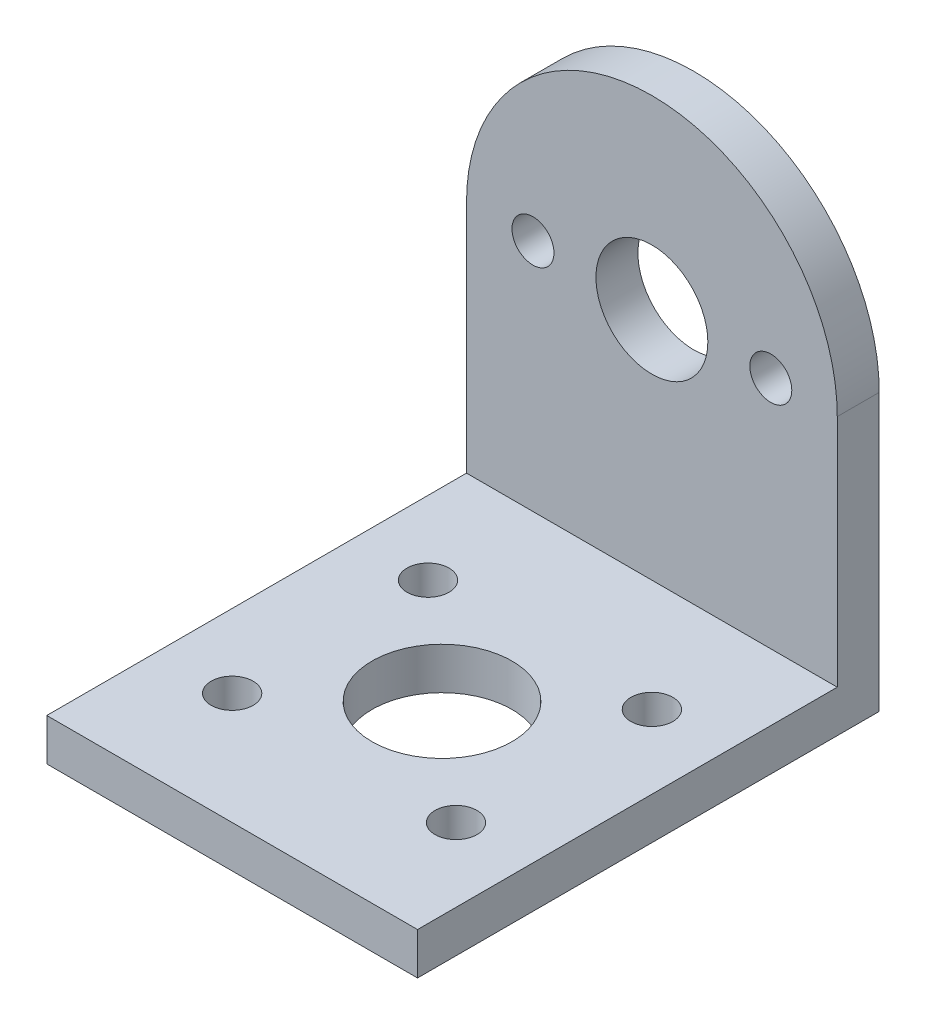
ISO-10303-21;
HEADER;
FILE_DESCRIPTION(('STEP AP214'),'2;1');
FILE_NAME('part.step','',(''),(''),'','','');
FILE_SCHEMA(('AUTOMOTIVE_DESIGN { 1 0 10303 214 1 1 1 1 }'));
ENDSEC;
DATA;
#1=APPLICATION_CONTEXT('core data for automotive mechanical design processes');
#2=APPLICATION_PROTOCOL_DEFINITION('international standard','automotive_design',2000,#1);
#3=PRODUCT_CONTEXT('',#1,'mechanical');
#4=PRODUCT('Part','Part','',(#3));
#5=PRODUCT_RELATED_PRODUCT_CATEGORY('part','',(#4));
#6=PRODUCT_DEFINITION_FORMATION('','',#4);
#7=PRODUCT_DEFINITION_CONTEXT('part definition',#1,'design');
#8=PRODUCT_DEFINITION('design','',#6,#7);
#9=PRODUCT_DEFINITION_SHAPE('','',#8);
#10=(LENGTH_UNIT() NAMED_UNIT(*) SI_UNIT(.MILLI.,.METRE.));
#11=(NAMED_UNIT(*) PLANE_ANGLE_UNIT() SI_UNIT($,.RADIAN.));
#12=(NAMED_UNIT(*) SI_UNIT($,.STERADIAN.) SOLID_ANGLE_UNIT());
#13=UNCERTAINTY_MEASURE_WITH_UNIT(LENGTH_MEASURE(1.E-05),#10,'distance_accuracy_value','');
#14=(GEOMETRIC_REPRESENTATION_CONTEXT(3) GLOBAL_UNCERTAINTY_ASSIGNED_CONTEXT((#13)) GLOBAL_UNIT_ASSIGNED_CONTEXT((#10,
#11,#12)) REPRESENTATION_CONTEXT('',''));
#15=CARTESIAN_POINT('',(0.,0.,0.));
#16=DIRECTION('',(0.,0.,1.));
#17=DIRECTION('',(1.,0.,0.));
#18=AXIS2_PLACEMENT_3D('',#15,#16,#17);
#19=CARTESIAN_POINT('',(0.,3.,0.));
#20=DIRECTION('',(0.,1.,0.));
#21=DIRECTION('',(0.,0.,1.));
#22=AXIS2_PLACEMENT_3D('',#19,#20,#21);
#23=PLANE('',#22);
#24=DIRECTION('',(1.,0.,0.));
#25=VECTOR('',#24,1.);
#26=CARTESIAN_POINT('',(-13.25,3.,3.));
#27=LINE('',#26,#25);
#28=CARTESIAN_POINT('',(-13.25,3.,3.));
#29=VERTEX_POINT('',#28);
#30=CARTESIAN_POINT('',(13.25,3.,3.));
#31=VERTEX_POINT('',#30);
#32=EDGE_CURVE('E49',#29,#31,#27,.T.);
#33=ORIENTED_EDGE('',*,*,#32,.F.);
#34=DIRECTION('',(0.,0.,1.));
#35=VECTOR('',#34,1.);
#36=CARTESIAN_POINT('',(-13.25,3.,0.));
#37=LINE('',#36,#35);
#38=CARTESIAN_POINT('',(-13.25,3.,33.));
#39=VERTEX_POINT('',#38);
#40=EDGE_CURVE('E88',#29,#39,#37,.T.);
#41=ORIENTED_EDGE('',*,*,#40,.T.);
#42=DIRECTION('',(1.,0.,0.));
#43=VECTOR('',#42,1.);
#44=CARTESIAN_POINT('',(-13.25,3.,33.));
#45=LINE('',#44,#43);
#46=CARTESIAN_POINT('',(13.25,3.,33.));
#47=VERTEX_POINT('',#46);
#48=EDGE_CURVE('E55',#39,#47,#45,.T.);
#49=ORIENTED_EDGE('',*,*,#48,.T.);
#50=DIRECTION('',(0.,0.,-1.));
#51=VECTOR('',#50,1.);
#52=CARTESIAN_POINT('',(13.25,3.,0.));
#53=LINE('',#52,#51);
#54=EDGE_CURVE('E99',#47,#31,#53,.T.);
#55=ORIENTED_EDGE('',*,*,#54,.T.);
#56=EDGE_LOOP('',(#33,#41,#49,#55));
#57=FACE_BOUND('',#56,.T.);
#58=CARTESIAN_POINT('',(-8.,3.,25.));
#59=DIRECTION('',(0.,1.,0.));
#60=DIRECTION('',(0.,0.,1.));
#61=AXIS2_PLACEMENT_3D('',#58,#59,#60);
#62=CIRCLE('',#61,1.5);
#63=CARTESIAN_POINT('',(-8.,3.,26.5));
#64=VERTEX_POINT('',#63);
#65=EDGE_CURVE('E151',#64,#64,#62,.T.);
#66=ORIENTED_EDGE('',*,*,#65,.F.);
#67=EDGE_LOOP('',(#66));
#68=FACE_BOUND('',#67,.T.);
#69=CARTESIAN_POINT('',(8.,3.,11.));
#70=DIRECTION('',(0.,1.,0.));
#71=DIRECTION('',(0.,0.,1.));
#72=AXIS2_PLACEMENT_3D('',#69,#70,#71);
#73=CIRCLE('',#72,1.5);
#74=CARTESIAN_POINT('',(8.,3.,12.5));
#75=VERTEX_POINT('',#74);
#76=EDGE_CURVE('E163',#75,#75,#73,.T.);
#77=ORIENTED_EDGE('',*,*,#76,.F.);
#78=EDGE_LOOP('',(#77));
#79=FACE_BOUND('',#78,.T.);
#80=CARTESIAN_POINT('',(0.,3.,18.));
#81=DIRECTION('',(0.,1.,0.));
#82=DIRECTION('',(0.,0.,1.));
#83=AXIS2_PLACEMENT_3D('',#80,#81,#82);
#84=CIRCLE('',#83,5.);
#85=CARTESIAN_POINT('',(0.,3.,23.));
#86=VERTEX_POINT('',#85);
#87=EDGE_CURVE('E104',#86,#86,#84,.T.);
#88=ORIENTED_EDGE('',*,*,#87,.F.);
#89=EDGE_LOOP('',(#88));
#90=FACE_BOUND('',#89,.T.);
#91=CARTESIAN_POINT('',(-8.,3.,11.));
#92=DIRECTION('',(0.,1.,0.));
#93=DIRECTION('',(0.,0.,1.));
#94=AXIS2_PLACEMENT_3D('',#91,#92,#93);
#95=CIRCLE('',#94,1.5);
#96=CARTESIAN_POINT('',(-8.,3.,12.5));
#97=VERTEX_POINT('',#96);
#98=EDGE_CURVE('E157',#97,#97,#95,.T.);
#99=ORIENTED_EDGE('',*,*,#98,.F.);
#100=EDGE_LOOP('',(#99));
#101=FACE_BOUND('',#100,.T.);
#102=CARTESIAN_POINT('',(8.,3.,25.));
#103=DIRECTION('',(0.,1.,0.));
#104=DIRECTION('',(0.,0.,1.));
#105=AXIS2_PLACEMENT_3D('',#102,#103,#104);
#106=CIRCLE('',#105,1.5);
#107=CARTESIAN_POINT('',(8.,3.,26.5));
#108=VERTEX_POINT('',#107);
#109=EDGE_CURVE('E145',#108,#108,#106,.T.);
#110=ORIENTED_EDGE('',*,*,#109,.F.);
#111=EDGE_LOOP('',(#110));
#112=FACE_BOUND('',#111,.T.);
#113=ADVANCED_FACE('F34',(#57,#68,#79,#90,#101,#112),#23,.T.);
#114=CARTESIAN_POINT('',(0.,0.,0.));
#115=DIRECTION('',(0.,1.,0.));
#116=DIRECTION('',(0.,0.,1.));
#117=AXIS2_PLACEMENT_3D('',#114,#115,#116);
#118=PLANE('',#117);
#119=DIRECTION('',(0.,0.,1.));
#120=VECTOR('',#119,1.);
#121=CARTESIAN_POINT('',(-13.25,0.,0.));
#122=LINE('',#121,#120);
#123=CARTESIAN_POINT('',(-13.25,0.,0.));
#124=VERTEX_POINT('',#123);
#125=CARTESIAN_POINT('',(-13.25,0.,33.));
#126=VERTEX_POINT('',#125);
#127=EDGE_CURVE('E95',#124,#126,#122,.T.);
#128=ORIENTED_EDGE('',*,*,#127,.F.);
#129=DIRECTION('',(-1.,0.,0.));
#130=VECTOR('',#129,1.);
#131=CARTESIAN_POINT('',(-13.25,0.,0.));
#132=LINE('',#131,#130);
#133=CARTESIAN_POINT('',(13.25,0.,0.));
#134=VERTEX_POINT('',#133);
#135=EDGE_CURVE('E75',#134,#124,#132,.T.);
#136=ORIENTED_EDGE('',*,*,#135,.F.);
#137=DIRECTION('',(0.,0.,-1.));
#138=VECTOR('',#137,1.);
#139=CARTESIAN_POINT('',(13.25,0.,0.));
#140=LINE('',#139,#138);
#141=CARTESIAN_POINT('',(13.25,0.,33.));
#142=VERTEX_POINT('',#141);
#143=EDGE_CURVE('E89',#142,#134,#140,.T.);
#144=ORIENTED_EDGE('',*,*,#143,.F.);
#145=DIRECTION('',(1.,0.,0.));
#146=VECTOR('',#145,1.);
#147=CARTESIAN_POINT('',(-13.25,0.,33.));
#148=LINE('',#147,#146);
#149=EDGE_CURVE('E103',#126,#142,#148,.T.);
#150=ORIENTED_EDGE('',*,*,#149,.F.);
#151=EDGE_LOOP('',(#128,#136,#144,#150));
#152=FACE_BOUND('',#151,.T.);
#153=CARTESIAN_POINT('',(0.,0.,18.));
#154=DIRECTION('',(0.,1.,0.));
#155=DIRECTION('',(0.,0.,1.));
#156=AXIS2_PLACEMENT_3D('',#153,#154,#155);
#157=CIRCLE('',#156,5.);
#158=CARTESIAN_POINT('',(0.,0.,23.));
#159=VERTEX_POINT('',#158);
#160=EDGE_CURVE('E108',#159,#159,#157,.T.);
#161=ORIENTED_EDGE('',*,*,#160,.T.);
#162=EDGE_LOOP('',(#161));
#163=FACE_BOUND('',#162,.T.);
#164=CARTESIAN_POINT('',(8.,0.,11.));
#165=DIRECTION('',(0.,1.,0.));
#166=DIRECTION('',(0.,0.,1.));
#167=AXIS2_PLACEMENT_3D('',#164,#165,#166);
#168=CIRCLE('',#167,1.5);
#169=CARTESIAN_POINT('',(8.,0.,12.5));
#170=VERTEX_POINT('',#169);
#171=EDGE_CURVE('E160',#170,#170,#168,.T.);
#172=ORIENTED_EDGE('',*,*,#171,.T.);
#173=EDGE_LOOP('',(#172));
#174=FACE_BOUND('',#173,.T.);
#175=CARTESIAN_POINT('',(-8.,0.,11.));
#176=DIRECTION('',(0.,1.,0.));
#177=DIRECTION('',(0.,0.,1.));
#178=AXIS2_PLACEMENT_3D('',#175,#176,#177);
#179=CIRCLE('',#178,1.5);
#180=CARTESIAN_POINT('',(-8.,0.,12.5));
#181=VERTEX_POINT('',#180);
#182=EDGE_CURVE('E154',#181,#181,#179,.T.);
#183=ORIENTED_EDGE('',*,*,#182,.T.);
#184=EDGE_LOOP('',(#183));
#185=FACE_BOUND('',#184,.T.);
#186=CARTESIAN_POINT('',(-8.,0.,25.));
#187=DIRECTION('',(0.,1.,0.));
#188=DIRECTION('',(0.,0.,1.));
#189=AXIS2_PLACEMENT_3D('',#186,#187,#188);
#190=CIRCLE('',#189,1.5);
#191=CARTESIAN_POINT('',(-8.,0.,26.5));
#192=VERTEX_POINT('',#191);
#193=EDGE_CURVE('E148',#192,#192,#190,.T.);
#194=ORIENTED_EDGE('',*,*,#193,.T.);
#195=EDGE_LOOP('',(#194));
#196=FACE_BOUND('',#195,.T.);
#197=CARTESIAN_POINT('',(8.,0.,25.));
#198=DIRECTION('',(0.,1.,0.));
#199=DIRECTION('',(0.,0.,1.));
#200=AXIS2_PLACEMENT_3D('',#197,#198,#199);
#201=CIRCLE('',#200,1.5);
#202=CARTESIAN_POINT('',(8.,0.,26.5));
#203=VERTEX_POINT('',#202);
#204=EDGE_CURVE('E144',#203,#203,#201,.T.);
#205=ORIENTED_EDGE('',*,*,#204,.T.);
#206=EDGE_LOOP('',(#205));
#207=FACE_BOUND('',#206,.T.);
#208=ADVANCED_FACE('F101',(#152,#163,#174,#185,#196,#207),#118,.F.);
#209=CARTESIAN_POINT('',(-13.25,3.,0.));
#210=DIRECTION('',(1.,0.,0.));
#211=DIRECTION('',(0.,0.,-1.));
#212=AXIS2_PLACEMENT_3D('',#209,#210,#211);
#213=PLANE('',#212);
#214=ORIENTED_EDGE('',*,*,#127,.T.);
#215=DIRECTION('',(0.,-1.,0.));
#216=VECTOR('',#215,1.);
#217=CARTESIAN_POINT('',(-13.25,3.,33.));
#218=LINE('',#217,#216);
#219=EDGE_CURVE('E11',#39,#126,#218,.T.);
#220=ORIENTED_EDGE('',*,*,#219,.F.);
#221=ORIENTED_EDGE('',*,*,#40,.F.);
#222=DIRECTION('',(0.,-1.,0.));
#223=VECTOR('',#222,1.);
#224=CARTESIAN_POINT('',(-13.25,3.,3.));
#225=LINE('',#224,#223);
#226=CARTESIAN_POINT('',(-13.25,19.75,3.));
#227=VERTEX_POINT('',#226);
#228=EDGE_CURVE('E122',#227,#29,#225,.T.);
#229=ORIENTED_EDGE('',*,*,#228,.F.);
#230=DIRECTION('',(0.,0.,-1.));
#231=VECTOR('',#230,1.);
#232=CARTESIAN_POINT('',(-13.25,19.75,3.));
#233=LINE('',#232,#231);
#234=CARTESIAN_POINT('',(-13.25,19.75,0.));
#235=VERTEX_POINT('',#234);
#236=EDGE_CURVE('E98',#227,#235,#233,.T.);
#237=ORIENTED_EDGE('',*,*,#236,.T.);
#238=DIRECTION('',(0.,-1.,0.));
#239=VECTOR('',#238,1.);
#240=CARTESIAN_POINT('',(-13.25,3.,0.));
#241=LINE('',#240,#239);
#242=EDGE_CURVE('E81',#235,#124,#241,.T.);
#243=ORIENTED_EDGE('',*,*,#242,.T.);
#244=EDGE_LOOP('',(#214,#220,#221,#229,#237,#243));
#245=FACE_BOUND('',#244,.T.);
#246=ADVANCED_FACE('F36',(#245),#213,.F.);
#247=CARTESIAN_POINT('',(-13.25,3.,33.));
#248=DIRECTION('',(0.,0.,-1.));
#249=DIRECTION('',(-1.,0.,0.));
#250=AXIS2_PLACEMENT_3D('',#247,#248,#249);
#251=PLANE('',#250);
#252=ORIENTED_EDGE('',*,*,#149,.T.);
#253=DIRECTION('',(0.,-1.,0.));
#254=VECTOR('',#253,1.);
#255=CARTESIAN_POINT('',(13.25,3.,33.));
#256=LINE('',#255,#254);
#257=EDGE_CURVE('E42',#47,#142,#256,.T.);
#258=ORIENTED_EDGE('',*,*,#257,.F.);
#259=ORIENTED_EDGE('',*,*,#48,.F.);
#260=ORIENTED_EDGE('',*,*,#219,.T.);
#261=EDGE_LOOP('',(#252,#258,#259,#260));
#262=FACE_BOUND('',#261,.T.);
#263=ADVANCED_FACE('F120',(#262),#251,.F.);
#264=CARTESIAN_POINT('',(13.25,3.,0.));
#265=DIRECTION('',(-1.,0.,0.));
#266=DIRECTION('',(0.,0.,1.));
#267=AXIS2_PLACEMENT_3D('',#264,#265,#266);
#268=PLANE('',#267);
#269=ORIENTED_EDGE('',*,*,#143,.T.);
#270=DIRECTION('',(0.,-1.,0.));
#271=VECTOR('',#270,1.);
#272=CARTESIAN_POINT('',(13.25,3.,0.));
#273=LINE('',#272,#271);
#274=CARTESIAN_POINT('',(13.25,19.75,0.));
#275=VERTEX_POINT('',#274);
#276=EDGE_CURVE('E84',#275,#134,#273,.T.);
#277=ORIENTED_EDGE('',*,*,#276,.F.);
#278=DIRECTION('',(0.,0.,-1.));
#279=VECTOR('',#278,1.);
#280=CARTESIAN_POINT('',(13.25,19.75,3.));
#281=LINE('',#280,#279);
#282=CARTESIAN_POINT('',(13.25,19.75,3.));
#283=VERTEX_POINT('',#282);
#284=EDGE_CURVE('E133',#283,#275,#281,.T.);
#285=ORIENTED_EDGE('',*,*,#284,.F.);
#286=DIRECTION('',(0.,1.,0.));
#287=VECTOR('',#286,1.);
#288=CARTESIAN_POINT('',(13.25,3.,3.));
#289=LINE('',#288,#287);
#290=EDGE_CURVE('E135',#31,#283,#289,.T.);
#291=ORIENTED_EDGE('',*,*,#290,.F.);
#292=ORIENTED_EDGE('',*,*,#54,.F.);
#293=ORIENTED_EDGE('',*,*,#257,.T.);
#294=EDGE_LOOP('',(#269,#277,#285,#291,#292,#293));
#295=FACE_BOUND('',#294,.T.);
#296=ADVANCED_FACE('F117',(#295),#268,.F.);
#297=CARTESIAN_POINT('',(-13.25,3.,0.));
#298=DIRECTION('',(0.,0.,1.));
#299=DIRECTION('',(1.,0.,0.));
#300=AXIS2_PLACEMENT_3D('',#297,#298,#299);
#301=PLANE('',#300);
#302=ORIENTED_EDGE('',*,*,#135,.T.);
#303=ORIENTED_EDGE('',*,*,#242,.F.);
#304=CARTESIAN_POINT('',(0.,19.75,0.));
#305=DIRECTION('',(0.,0.,1.));
#306=DIRECTION('',(-1.,0.,0.));
#307=AXIS2_PLACEMENT_3D('',#304,#305,#306);
#308=CIRCLE('',#307,13.25);
#309=EDGE_CURVE('E139',#275,#235,#308,.T.);
#310=ORIENTED_EDGE('',*,*,#309,.F.);
#311=ORIENTED_EDGE('',*,*,#276,.T.);
#312=EDGE_LOOP('',(#302,#303,#310,#311));
#313=FACE_BOUND('',#312,.T.);
#314=CARTESIAN_POINT('',(-8.5,19.75,0.));
#315=DIRECTION('',(0.,0.,1.));
#316=DIRECTION('',(1.,0.,0.));
#317=AXIS2_PLACEMENT_3D('',#314,#315,#316);
#318=CIRCLE('',#317,1.5);
#319=CARTESIAN_POINT('',(-7.,19.75,0.));
#320=VERTEX_POINT('',#319);
#321=EDGE_CURVE('E181',#320,#320,#318,.T.);
#322=ORIENTED_EDGE('',*,*,#321,.T.);
#323=EDGE_LOOP('',(#322));
#324=FACE_BOUND('',#323,.T.);
#325=CARTESIAN_POINT('',(0.,19.75,0.));
#326=DIRECTION('',(0.,0.,1.));
#327=DIRECTION('',(1.,0.,0.));
#328=AXIS2_PLACEMENT_3D('',#325,#326,#327);
#329=CIRCLE('',#328,4.);
#330=CARTESIAN_POINT('',(4.,19.75,0.));
#331=VERTEX_POINT('',#330);
#332=EDGE_CURVE('E175',#331,#331,#329,.T.);
#333=ORIENTED_EDGE('',*,*,#332,.T.);
#334=EDGE_LOOP('',(#333));
#335=FACE_BOUND('',#334,.T.);
#336=CARTESIAN_POINT('',(8.5,19.75,0.));
#337=DIRECTION('',(0.,0.,1.));
#338=DIRECTION('',(1.,0.,0.));
#339=AXIS2_PLACEMENT_3D('',#336,#337,#338);
#340=CIRCLE('',#339,1.5);
#341=CARTESIAN_POINT('',(10.,19.75,0.));
#342=VERTEX_POINT('',#341);
#343=EDGE_CURVE('E187',#342,#342,#340,.T.);
#344=ORIENTED_EDGE('',*,*,#343,.T.);
#345=EDGE_LOOP('',(#344));
#346=FACE_BOUND('',#345,.T.);
#347=ADVANCED_FACE('F77',(#313,#324,#335,#346),#301,.F.);
#348=CARTESIAN_POINT('',(0.,3.,18.));
#349=DIRECTION('',(0.,-1.,0.));
#350=DIRECTION('',(0.,0.,-1.));
#351=AXIS2_PLACEMENT_3D('',#348,#349,#350);
#352=CYLINDRICAL_SURFACE('',#351,5.);
#353=ORIENTED_EDGE('',*,*,#87,.T.);
#354=EDGE_LOOP('',(#353));
#355=FACE_BOUND('',#354,.T.);
#356=ORIENTED_EDGE('',*,*,#160,.F.);
#357=EDGE_LOOP('',(#356));
#358=FACE_BOUND('',#357,.T.);
#359=ADVANCED_FACE('F218',(#355,#358),#352,.F.);
#360=CARTESIAN_POINT('',(8.,3.,11.));
#361=DIRECTION('',(0.,-1.,0.));
#362=DIRECTION('',(0.,0.,-1.));
#363=AXIS2_PLACEMENT_3D('',#360,#361,#362);
#364=CYLINDRICAL_SURFACE('',#363,1.5);
#365=ORIENTED_EDGE('',*,*,#76,.T.);
#366=EDGE_LOOP('',(#365));
#367=FACE_BOUND('',#366,.T.);
#368=ORIENTED_EDGE('',*,*,#171,.F.);
#369=EDGE_LOOP('',(#368));
#370=FACE_BOUND('',#369,.T.);
#371=ADVANCED_FACE('F251',(#367,#370),#364,.F.);
#372=CARTESIAN_POINT('',(-8.,3.,11.));
#373=DIRECTION('',(0.,-1.,0.));
#374=DIRECTION('',(0.,0.,-1.));
#375=AXIS2_PLACEMENT_3D('',#372,#373,#374);
#376=CYLINDRICAL_SURFACE('',#375,1.5);
#377=ORIENTED_EDGE('',*,*,#98,.T.);
#378=EDGE_LOOP('',(#377));
#379=FACE_BOUND('',#378,.T.);
#380=ORIENTED_EDGE('',*,*,#182,.F.);
#381=EDGE_LOOP('',(#380));
#382=FACE_BOUND('',#381,.T.);
#383=ADVANCED_FACE('F261',(#379,#382),#376,.F.);
#384=CARTESIAN_POINT('',(-8.,3.,25.));
#385=DIRECTION('',(0.,-1.,0.));
#386=DIRECTION('',(0.,0.,-1.));
#387=AXIS2_PLACEMENT_3D('',#384,#385,#386);
#388=CYLINDRICAL_SURFACE('',#387,1.5);
#389=ORIENTED_EDGE('',*,*,#65,.T.);
#390=EDGE_LOOP('',(#389));
#391=FACE_BOUND('',#390,.T.);
#392=ORIENTED_EDGE('',*,*,#193,.F.);
#393=EDGE_LOOP('',(#392));
#394=FACE_BOUND('',#393,.T.);
#395=ADVANCED_FACE('F207',(#391,#394),#388,.F.);
#396=CARTESIAN_POINT('',(8.,3.,25.));
#397=DIRECTION('',(0.,-1.,0.));
#398=DIRECTION('',(0.,0.,-1.));
#399=AXIS2_PLACEMENT_3D('',#396,#397,#398);
#400=CYLINDRICAL_SURFACE('',#399,1.5);
#401=ORIENTED_EDGE('',*,*,#109,.T.);
#402=EDGE_LOOP('',(#401));
#403=FACE_BOUND('',#402,.T.);
#404=ORIENTED_EDGE('',*,*,#204,.F.);
#405=EDGE_LOOP('',(#404));
#406=FACE_BOUND('',#405,.T.);
#407=ADVANCED_FACE('F198',(#403,#406),#400,.F.);
#408=CARTESIAN_POINT('',(0.,19.75,3.));
#409=DIRECTION('',(0.,0.,-1.));
#410=DIRECTION('',(-1.,0.,0.));
#411=AXIS2_PLACEMENT_3D('',#408,#409,#410);
#412=PLANE('',#411);
#413=ORIENTED_EDGE('',*,*,#32,.T.);
#414=ORIENTED_EDGE('',*,*,#290,.T.);
#415=CARTESIAN_POINT('',(0.,19.75,3.));
#416=DIRECTION('',(0.,0.,1.));
#417=DIRECTION('',(-1.,0.,0.));
#418=AXIS2_PLACEMENT_3D('',#415,#416,#417);
#419=CIRCLE('',#418,13.25);
#420=EDGE_CURVE('E131',#283,#227,#419,.T.);
#421=ORIENTED_EDGE('',*,*,#420,.T.);
#422=ORIENTED_EDGE('',*,*,#228,.T.);
#423=EDGE_LOOP('',(#413,#414,#421,#422));
#424=FACE_BOUND('',#423,.T.);
#425=CARTESIAN_POINT('',(0.,19.75,3.));
#426=DIRECTION('',(0.,0.,1.));
#427=DIRECTION('',(1.,0.,0.));
#428=AXIS2_PLACEMENT_3D('',#425,#426,#427);
#429=CIRCLE('',#428,4.);
#430=CARTESIAN_POINT('',(4.,19.75,3.));
#431=VERTEX_POINT('',#430);
#432=EDGE_CURVE('E140',#431,#431,#429,.T.);
#433=ORIENTED_EDGE('',*,*,#432,.F.);
#434=EDGE_LOOP('',(#433));
#435=FACE_BOUND('',#434,.T.);
#436=CARTESIAN_POINT('',(-8.5,19.75,3.));
#437=DIRECTION('',(0.,0.,1.));
#438=DIRECTION('',(1.,0.,0.));
#439=AXIS2_PLACEMENT_3D('',#436,#437,#438);
#440=CIRCLE('',#439,1.5);
#441=CARTESIAN_POINT('',(-7.,19.75,3.));
#442=VERTEX_POINT('',#441);
#443=EDGE_CURVE('E178',#442,#442,#440,.T.);
#444=ORIENTED_EDGE('',*,*,#443,.F.);
#445=EDGE_LOOP('',(#444));
#446=FACE_BOUND('',#445,.T.);
#447=CARTESIAN_POINT('',(8.5,19.75,3.));
#448=DIRECTION('',(0.,0.,1.));
#449=DIRECTION('',(1.,0.,0.));
#450=AXIS2_PLACEMENT_3D('',#447,#448,#449);
#451=CIRCLE('',#450,1.5);
#452=CARTESIAN_POINT('',(10.,19.75,3.));
#453=VERTEX_POINT('',#452);
#454=EDGE_CURVE('E184',#453,#453,#451,.T.);
#455=ORIENTED_EDGE('',*,*,#454,.F.);
#456=EDGE_LOOP('',(#455));
#457=FACE_BOUND('',#456,.T.);
#458=ADVANCED_FACE('F126',(#424,#435,#446,#457),#412,.F.);
#459=CARTESIAN_POINT('',(0.,19.75,3.));
#460=DIRECTION('',(0.,0.,-1.));
#461=DIRECTION('',(-1.,0.,0.));
#462=AXIS2_PLACEMENT_3D('',#459,#460,#461);
#463=CYLINDRICAL_SURFACE('',#462,13.25);
#464=ORIENTED_EDGE('',*,*,#309,.T.);
#465=ORIENTED_EDGE('',*,*,#236,.F.);
#466=ORIENTED_EDGE('',*,*,#420,.F.);
#467=ORIENTED_EDGE('',*,*,#284,.T.);
#468=EDGE_LOOP('',(#464,#465,#466,#467));
#469=FACE_BOUND('',#468,.T.);
#470=ADVANCED_FACE('F197',(#469),#463,.T.);
#471=CARTESIAN_POINT('',(0.,19.75,3.));
#472=DIRECTION('',(0.,0.,-1.));
#473=DIRECTION('',(-1.,0.,0.));
#474=AXIS2_PLACEMENT_3D('',#471,#472,#473);
#475=CYLINDRICAL_SURFACE('',#474,4.);
#476=ORIENTED_EDGE('',*,*,#432,.T.);
#477=EDGE_LOOP('',(#476));
#478=FACE_BOUND('',#477,.T.);
#479=ORIENTED_EDGE('',*,*,#332,.F.);
#480=EDGE_LOOP('',(#479));
#481=FACE_BOUND('',#480,.T.);
#482=ADVANCED_FACE('F204',(#478,#481),#475,.F.);
#483=CARTESIAN_POINT('',(-8.5,19.75,3.));
#484=DIRECTION('',(0.,0.,-1.));
#485=DIRECTION('',(-1.,0.,0.));
#486=AXIS2_PLACEMENT_3D('',#483,#484,#485);
#487=CYLINDRICAL_SURFACE('',#486,1.5);
#488=ORIENTED_EDGE('',*,*,#443,.T.);
#489=EDGE_LOOP('',(#488));
#490=FACE_BOUND('',#489,.T.);
#491=ORIENTED_EDGE('',*,*,#321,.F.);
#492=EDGE_LOOP('',(#491));
#493=FACE_BOUND('',#492,.T.);
#494=ADVANCED_FACE('F324',(#490,#493),#487,.F.);
#495=CARTESIAN_POINT('',(8.5,19.75,3.));
#496=DIRECTION('',(0.,0.,-1.));
#497=DIRECTION('',(-1.,0.,0.));
#498=AXIS2_PLACEMENT_3D('',#495,#496,#497);
#499=CYLINDRICAL_SURFACE('',#498,1.5);
#500=ORIENTED_EDGE('',*,*,#454,.T.);
#501=EDGE_LOOP('',(#500));
#502=FACE_BOUND('',#501,.T.);
#503=ORIENTED_EDGE('',*,*,#343,.F.);
#504=EDGE_LOOP('',(#503));
#505=FACE_BOUND('',#504,.T.);
#506=ADVANCED_FACE('F193',(#502,#505),#499,.F.);
#507=CLOSED_SHELL('',(#113,#208,#246,#263,#296,#347,#359,#371,#383,#395,#407,#458,#470,#482,
#494,#506));
#508=MANIFOLD_SOLID_BREP('B2',#507);
#509=ADVANCED_BREP_SHAPE_REPRESENTATION('',(#18,#508),#14);
#510=SHAPE_DEFINITION_REPRESENTATION(#9,#509);
ENDSEC;
END-ISO-10303-21;
